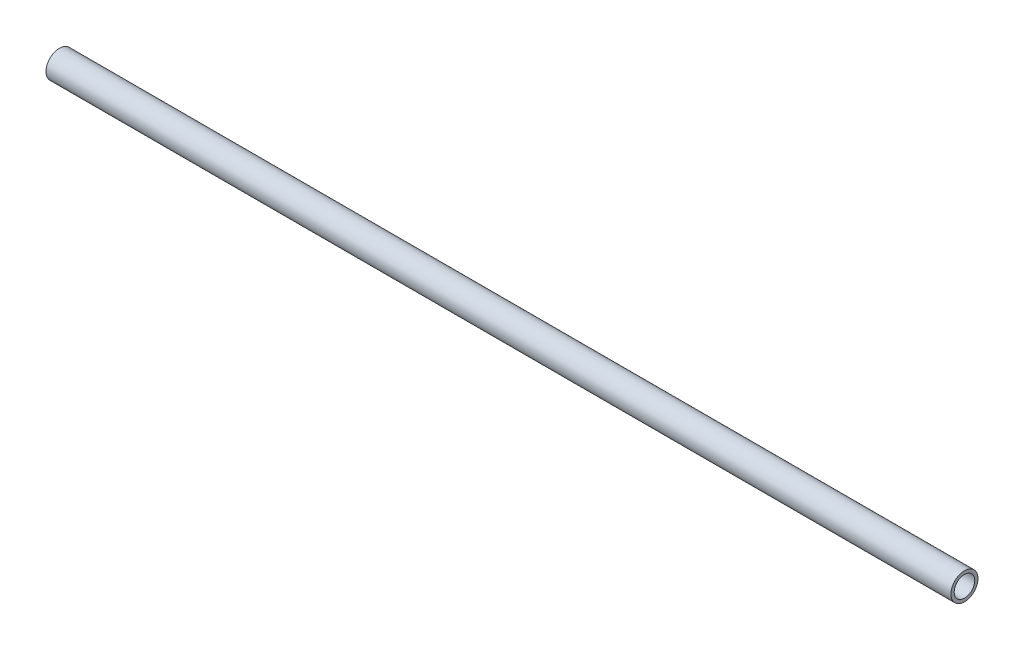
ISO-10303-21;
HEADER;
FILE_DESCRIPTION(('STEP AP214'),'2;1');
FILE_NAME('part.step','',(''),(''),'','','');
FILE_SCHEMA(('AUTOMOTIVE_DESIGN { 1 0 10303 214 1 1 1 1 }'));
ENDSEC;
DATA;
#1=APPLICATION_CONTEXT('core data for automotive mechanical design processes');
#2=APPLICATION_PROTOCOL_DEFINITION('international standard','automotive_design',2000,#1);
#3=PRODUCT_CONTEXT('',#1,'mechanical');
#4=PRODUCT('Part','Part','',(#3));
#5=PRODUCT_RELATED_PRODUCT_CATEGORY('part','',(#4));
#6=PRODUCT_DEFINITION_FORMATION('','',#4);
#7=PRODUCT_DEFINITION_CONTEXT('part definition',#1,'design');
#8=PRODUCT_DEFINITION('design','',#6,#7);
#9=PRODUCT_DEFINITION_SHAPE('','',#8);
#10=(LENGTH_UNIT() NAMED_UNIT(*) SI_UNIT(.MILLI.,.METRE.));
#11=(NAMED_UNIT(*) PLANE_ANGLE_UNIT() SI_UNIT($,.RADIAN.));
#12=(NAMED_UNIT(*) SI_UNIT($,.STERADIAN.) SOLID_ANGLE_UNIT());
#13=UNCERTAINTY_MEASURE_WITH_UNIT(LENGTH_MEASURE(1.E-05),#10,'distance_accuracy_value','');
#14=(GEOMETRIC_REPRESENTATION_CONTEXT(3) GLOBAL_UNCERTAINTY_ASSIGNED_CONTEXT((#13)) GLOBAL_UNIT_ASSIGNED_CONTEXT((#10,
#11,#12)) REPRESENTATION_CONTEXT('',''));
#15=CARTESIAN_POINT('',(0.,0.,0.));
#16=DIRECTION('',(0.,0.,1.));
#17=DIRECTION('',(1.,0.,0.));
#18=AXIS2_PLACEMENT_3D('',#15,#16,#17);
#19=CARTESIAN_POINT('',(850.,0.,0.));
#20=DIRECTION('',(1.,0.,0.));
#21=DIRECTION('',(0.,0.,-1.));
#22=AXIS2_PLACEMENT_3D('',#19,#20,#21);
#23=PLANE('',#22);
#24=CARTESIAN_POINT('',(850.,0.,0.));
#25=DIRECTION('',(1.,0.,0.));
#26=DIRECTION('',(0.,0.,-1.));
#27=AXIS2_PLACEMENT_3D('',#24,#25,#26);
#28=CIRCLE('',#27,12.7);
#29=CARTESIAN_POINT('',(850.,0.,-12.7));
#30=VERTEX_POINT('',#29);
#31=EDGE_CURVE('E10',#30,#30,#28,.T.);
#32=ORIENTED_EDGE('',*,*,#31,.T.);
#33=EDGE_LOOP('',(#32));
#34=FACE_BOUND('',#33,.T.);
#35=CARTESIAN_POINT('',(850.,0.,0.));
#36=DIRECTION('',(1.,0.,0.));
#37=DIRECTION('',(0.,0.,-1.));
#38=AXIS2_PLACEMENT_3D('',#35,#36,#37);
#39=CIRCLE('',#38,9.652);
#40=CARTESIAN_POINT('',(850.,0.,-9.652));
#41=VERTEX_POINT('',#40);
#42=EDGE_CURVE('E45',#41,#41,#39,.T.);
#43=ORIENTED_EDGE('',*,*,#42,.F.);
#44=EDGE_LOOP('',(#43));
#45=FACE_BOUND('',#44,.T.);
#46=ADVANCED_FACE('F34',(#34,#45),#23,.T.);
#47=CARTESIAN_POINT('',(0.,0.,0.));
#48=DIRECTION('',(1.,0.,0.));
#49=DIRECTION('',(0.,0.,-1.));
#50=AXIS2_PLACEMENT_3D('',#47,#48,#49);
#51=PLANE('',#50);
#52=CARTESIAN_POINT('',(0.,0.,0.));
#53=DIRECTION('',(1.,0.,0.));
#54=DIRECTION('',(0.,0.,-1.));
#55=AXIS2_PLACEMENT_3D('',#52,#53,#54);
#56=CIRCLE('',#55,12.7);
#57=CARTESIAN_POINT('',(0.,0.,-12.7));
#58=VERTEX_POINT('',#57);
#59=EDGE_CURVE('E38',#58,#58,#56,.T.);
#60=ORIENTED_EDGE('',*,*,#59,.F.);
#61=EDGE_LOOP('',(#60));
#62=FACE_BOUND('',#61,.T.);
#63=CARTESIAN_POINT('',(0.,0.,0.));
#64=DIRECTION('',(1.,0.,0.));
#65=DIRECTION('',(0.,0.,-1.));
#66=AXIS2_PLACEMENT_3D('',#63,#64,#65);
#67=CIRCLE('',#66,9.652);
#68=CARTESIAN_POINT('',(0.,0.,-9.652));
#69=VERTEX_POINT('',#68);
#70=EDGE_CURVE('E47',#69,#69,#67,.T.);
#71=ORIENTED_EDGE('',*,*,#70,.T.);
#72=EDGE_LOOP('',(#71));
#73=FACE_BOUND('',#72,.T.);
#74=ADVANCED_FACE('F57',(#62,#73),#51,.F.);
#75=CARTESIAN_POINT('',(850.,0.,0.));
#76=DIRECTION('',(-1.,0.,0.));
#77=DIRECTION('',(0.,0.,1.));
#78=AXIS2_PLACEMENT_3D('',#75,#76,#77);
#79=CYLINDRICAL_SURFACE('',#78,12.7);
#80=ORIENTED_EDGE('',*,*,#31,.F.);
#81=EDGE_LOOP('',(#80));
#82=FACE_BOUND('',#81,.T.);
#83=ORIENTED_EDGE('',*,*,#59,.T.);
#84=EDGE_LOOP('',(#83));
#85=FACE_BOUND('',#84,.T.);
#86=ADVANCED_FACE('F36',(#82,#85),#79,.T.);
#87=CARTESIAN_POINT('',(850.,0.,0.));
#88=DIRECTION('',(-1.,0.,0.));
#89=DIRECTION('',(0.,0.,1.));
#90=AXIS2_PLACEMENT_3D('',#87,#88,#89);
#91=CYLINDRICAL_SURFACE('',#90,9.652);
#92=ORIENTED_EDGE('',*,*,#42,.T.);
#93=EDGE_LOOP('',(#92));
#94=FACE_BOUND('',#93,.T.);
#95=ORIENTED_EDGE('',*,*,#70,.F.);
#96=EDGE_LOOP('',(#95));
#97=FACE_BOUND('',#96,.T.);
#98=ADVANCED_FACE('F53',(#94,#97),#91,.F.);
#99=CLOSED_SHELL('',(#46,#74,#86,#98));
#100=MANIFOLD_SOLID_BREP('B2',#99);
#101=ADVANCED_BREP_SHAPE_REPRESENTATION('',(#18,#100),#14);
#102=SHAPE_DEFINITION_REPRESENTATION(#9,#101);
ENDSEC;
END-ISO-10303-21;
